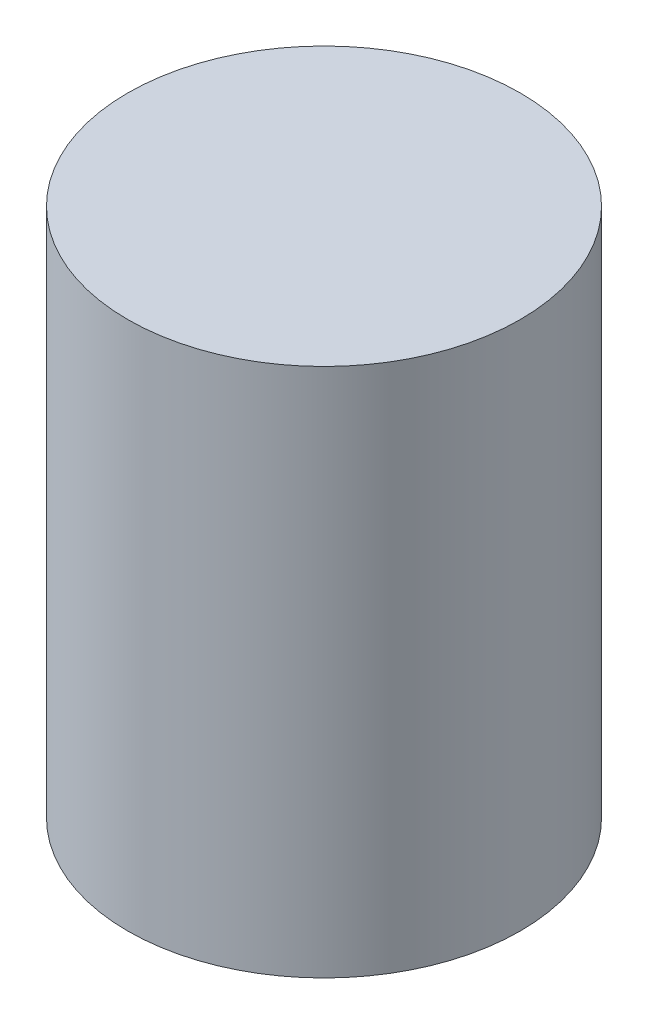
ISO-10303-21;
HEADER;
FILE_DESCRIPTION(('STEP AP214'),'2;1');
FILE_NAME('part.step','',(''),(''),'','','');
FILE_SCHEMA(('AUTOMOTIVE_DESIGN { 1 0 10303 214 1 1 1 1 }'));
ENDSEC;
DATA;
#1=APPLICATION_CONTEXT('core data for automotive mechanical design processes');
#2=APPLICATION_PROTOCOL_DEFINITION('international standard','automotive_design',2000,#1);
#3=PRODUCT_CONTEXT('',#1,'mechanical');
#4=PRODUCT('Part','Part','',(#3));
#5=PRODUCT_RELATED_PRODUCT_CATEGORY('part','',(#4));
#6=PRODUCT_DEFINITION_FORMATION('','',#4);
#7=PRODUCT_DEFINITION_CONTEXT('part definition',#1,'design');
#8=PRODUCT_DEFINITION('design','',#6,#7);
#9=PRODUCT_DEFINITION_SHAPE('','',#8);
#10=(LENGTH_UNIT() NAMED_UNIT(*) SI_UNIT(.MILLI.,.METRE.));
#11=(NAMED_UNIT(*) PLANE_ANGLE_UNIT() SI_UNIT($,.RADIAN.));
#12=(NAMED_UNIT(*) SI_UNIT($,.STERADIAN.) SOLID_ANGLE_UNIT());
#13=UNCERTAINTY_MEASURE_WITH_UNIT(LENGTH_MEASURE(1.E-05),#10,'distance_accuracy_value','');
#14=(GEOMETRIC_REPRESENTATION_CONTEXT(3) GLOBAL_UNCERTAINTY_ASSIGNED_CONTEXT((#13)) GLOBAL_UNIT_ASSIGNED_CONTEXT((#10,
#11,#12)) REPRESENTATION_CONTEXT('',''));
#15=CARTESIAN_POINT('',(0.,0.,0.));
#16=DIRECTION('',(0.,0.,1.));
#17=DIRECTION('',(1.,0.,0.));
#18=AXIS2_PLACEMENT_3D('',#15,#16,#17);
#19=CARTESIAN_POINT('',(-6.193,8.917,-8.723));
#20=DIRECTION('',(0.,-1.,0.));
#21=DIRECTION('',(0.,0.,-1.));
#22=AXIS2_PLACEMENT_3D('',#19,#20,#21);
#23=CYLINDRICAL_SURFACE('',#22,11.231);
#24=CARTESIAN_POINT('',(-6.193,8.917,-8.723));
#25=DIRECTION('',(0.,1.,0.));
#26=DIRECTION('',(0.,0.,1.));
#27=AXIS2_PLACEMENT_3D('',#24,#25,#26);
#28=CIRCLE('',#27,11.231);
#29=CARTESIAN_POINT('',(-6.193,8.917,2.508));
#30=VERTEX_POINT('',#29);
#31=EDGE_CURVE('E10',#30,#30,#28,.T.);
#32=ORIENTED_EDGE('',*,*,#31,.F.);
#33=EDGE_LOOP('',(#32));
#34=FACE_BOUND('',#33,.T.);
#35=CARTESIAN_POINT('',(-6.193,-21.389,-8.723));
#36=DIRECTION('',(0.,1.,0.));
#37=DIRECTION('',(0.,0.,1.));
#38=AXIS2_PLACEMENT_3D('',#35,#36,#37);
#39=CIRCLE('',#38,11.231);
#40=CARTESIAN_POINT('',(-6.193,-21.389,2.508));
#41=VERTEX_POINT('',#40);
#42=EDGE_CURVE('E44',#41,#41,#39,.T.);
#43=ORIENTED_EDGE('',*,*,#42,.T.);
#44=EDGE_LOOP('',(#43));
#45=FACE_BOUND('',#44,.T.);
#46=ADVANCED_FACE('F39',(#34,#45),#23,.T.);
#47=CARTESIAN_POINT('',(-6.193,8.917,-8.723));
#48=DIRECTION('',(0.,1.,0.));
#49=DIRECTION('',(0.,0.,1.));
#50=AXIS2_PLACEMENT_3D('',#47,#48,#49);
#51=PLANE('',#50);
#52=ORIENTED_EDGE('',*,*,#31,.T.);
#53=EDGE_LOOP('',(#52));
#54=FACE_BOUND('',#53,.T.);
#55=ADVANCED_FACE('F53',(#54),#51,.T.);
#56=CARTESIAN_POINT('',(-6.193,-21.389,-8.723));
#57=DIRECTION('',(0.,1.,0.));
#58=DIRECTION('',(0.,0.,1.));
#59=AXIS2_PLACEMENT_3D('',#56,#57,#58);
#60=PLANE('',#59);
#61=ORIENTED_EDGE('',*,*,#42,.F.);
#62=EDGE_LOOP('',(#61));
#63=FACE_BOUND('',#62,.T.);
#64=ADVANCED_FACE('F55',(#63),#60,.F.);
#65=CLOSED_SHELL('',(#46,#55,#64));
#66=MANIFOLD_SOLID_BREP('B2',#65);
#67=ADVANCED_BREP_SHAPE_REPRESENTATION('',(#18,#66),#14);
#68=SHAPE_DEFINITION_REPRESENTATION(#9,#67);
ENDSEC;
END-ISO-10303-21;
